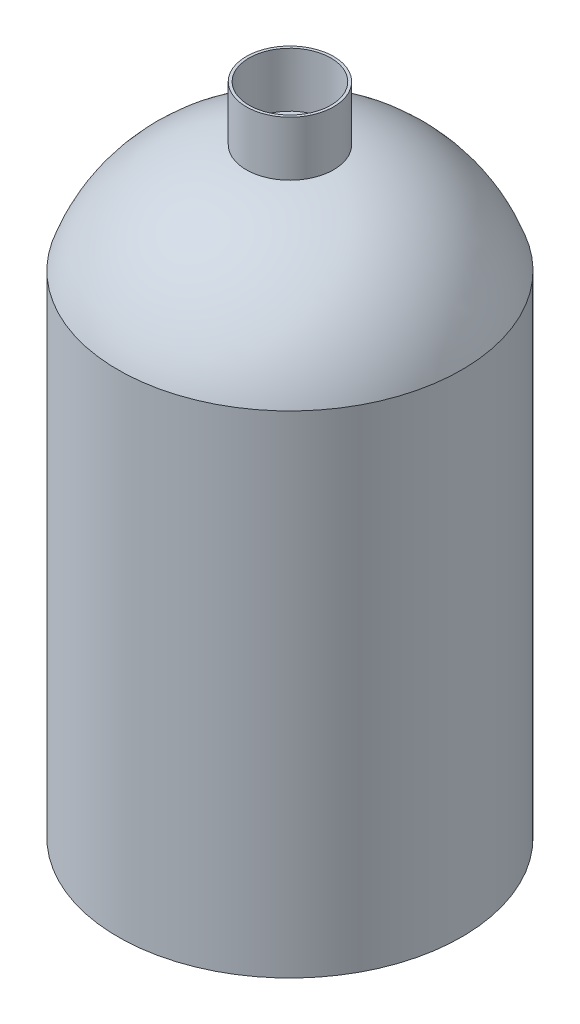
ISO-10303-21;
HEADER;
FILE_DESCRIPTION(('STEP AP214'),'2;1');
FILE_NAME('part.step','',(''),(''),'','','');
FILE_SCHEMA(('AUTOMOTIVE_DESIGN { 1 0 10303 214 1 1 1 1 }'));
ENDSEC;
DATA;
#1=APPLICATION_CONTEXT('core data for automotive mechanical design processes');
#2=APPLICATION_PROTOCOL_DEFINITION('international standard','automotive_design',2000,#1);
#3=PRODUCT_CONTEXT('',#1,'mechanical');
#4=PRODUCT('Part','Part','',(#3));
#5=PRODUCT_RELATED_PRODUCT_CATEGORY('part','',(#4));
#6=PRODUCT_DEFINITION_FORMATION('','',#4);
#7=PRODUCT_DEFINITION_CONTEXT('part definition',#1,'design');
#8=PRODUCT_DEFINITION('design','',#6,#7);
#9=PRODUCT_DEFINITION_SHAPE('','',#8);
#10=(LENGTH_UNIT() NAMED_UNIT(*) SI_UNIT(.MILLI.,.METRE.));
#11=(NAMED_UNIT(*) PLANE_ANGLE_UNIT() SI_UNIT($,.RADIAN.));
#12=(NAMED_UNIT(*) SI_UNIT($,.STERADIAN.) SOLID_ANGLE_UNIT());
#13=UNCERTAINTY_MEASURE_WITH_UNIT(LENGTH_MEASURE(1.E-05),#10,'distance_accuracy_value','');
#14=(GEOMETRIC_REPRESENTATION_CONTEXT(3) GLOBAL_UNCERTAINTY_ASSIGNED_CONTEXT((#13)) GLOBAL_UNIT_ASSIGNED_CONTEXT((#10,
#11,#12)) REPRESENTATION_CONTEXT('',''));
#15=CARTESIAN_POINT('',(0.,0.,0.));
#16=DIRECTION('',(0.,0.,1.));
#17=DIRECTION('',(1.,0.,0.));
#18=AXIS2_PLACEMENT_3D('',#15,#16,#17);
#19=CARTESIAN_POINT('',(0.,0.,0.));
#20=DIRECTION('',(0.,1.,0.));
#21=DIRECTION('',(0.,0.,1.));
#22=AXIS2_PLACEMENT_3D('',#19,#20,#21);
#23=PLANE('',#22);
#24=CARTESIAN_POINT('',(0.,0.,0.));
#25=DIRECTION('',(0.,-1.,0.));
#26=DIRECTION('',(0.,0.,-1.));
#27=AXIS2_PLACEMENT_3D('',#24,#25,#26);
#28=CIRCLE('',#27,6.3);
#29=CARTESIAN_POINT('',(0.,0.,-6.3));
#30=VERTEX_POINT('',#29);
#31=EDGE_CURVE('E57',#30,#30,#28,.T.);
#32=ORIENTED_EDGE('',*,*,#31,.T.);
#33=EDGE_LOOP('',(#32));
#34=FACE_BOUND('',#33,.T.);
#35=ADVANCED_FACE('F35',(#34),#23,.F.);
#36=CARTESIAN_POINT('',(0.,22.,0.));
#37=DIRECTION('',(0.,-1.,0.));
#38=DIRECTION('',(0.,0.,-1.));
#39=AXIS2_PLACEMENT_3D('',#36,#37,#38);
#40=PLANE('',#39);
#41=CARTESIAN_POINT('',(0.,22.,0.));
#42=DIRECTION('',(0.,-1.,0.));
#43=DIRECTION('',(0.,0.,-1.));
#44=AXIS2_PLACEMENT_3D('',#41,#42,#43);
#45=CIRCLE('',#44,1.5);
#46=CARTESIAN_POINT('',(0.,22.,-1.5));
#47=VERTEX_POINT('',#46);
#48=EDGE_CURVE('E10',#47,#47,#45,.T.);
#49=ORIENTED_EDGE('',*,*,#48,.F.);
#50=EDGE_LOOP('',(#49));
#51=FACE_BOUND('',#50,.T.);
#52=ADVANCED_FACE('F87',(#51),#40,.F.);
#53=CARTESIAN_POINT('',(0.,0.,0.));
#54=DIRECTION('',(0.,-1.,0.));
#55=DIRECTION('',(0.,0.,-1.));
#56=AXIS2_PLACEMENT_3D('',#53,#54,#55);
#57=CYLINDRICAL_SURFACE('',#56,1.5);
#58=CARTESIAN_POINT('',(0.,24.,0.));
#59=DIRECTION('',(0.,-1.,0.));
#60=DIRECTION('',(0.,0.,-1.));
#61=AXIS2_PLACEMENT_3D('',#58,#59,#60);
#62=CIRCLE('',#61,1.5);
#63=CARTESIAN_POINT('',(0.,24.,-1.5));
#64=VERTEX_POINT('',#63);
#65=EDGE_CURVE('E41',#64,#64,#62,.T.);
#66=ORIENTED_EDGE('',*,*,#65,.F.);
#67=EDGE_LOOP('',(#66));
#68=FACE_BOUND('',#67,.T.);
#69=ORIENTED_EDGE('',*,*,#48,.T.);
#70=EDGE_LOOP('',(#69));
#71=FACE_BOUND('',#70,.T.);
#72=ADVANCED_FACE('F82',(#68,#71),#57,.F.);
#73=CARTESIAN_POINT('',(-1.5,24.,0.));
#74=DIRECTION('',(0.,-1.,0.));
#75=DIRECTION('',(0.,0.,-1.));
#76=AXIS2_PLACEMENT_3D('',#73,#74,#75);
#77=PLANE('',#76);
#78=CARTESIAN_POINT('',(0.,24.,0.));
#79=DIRECTION('',(0.,-1.,0.));
#80=DIRECTION('',(0.,0.,-1.));
#81=AXIS2_PLACEMENT_3D('',#78,#79,#80);
#82=CIRCLE('',#81,1.6);
#83=CARTESIAN_POINT('',(0.,24.,-1.6));
#84=VERTEX_POINT('',#83);
#85=EDGE_CURVE('E45',#84,#84,#82,.T.);
#86=ORIENTED_EDGE('',*,*,#85,.F.);
#87=EDGE_LOOP('',(#86));
#88=FACE_BOUND('',#87,.T.);
#89=ORIENTED_EDGE('',*,*,#65,.T.);
#90=EDGE_LOOP('',(#89));
#91=FACE_BOUND('',#90,.T.);
#92=ADVANCED_FACE('F77',(#88,#91),#77,.F.);
#93=CARTESIAN_POINT('',(0.,0.,0.));
#94=DIRECTION('',(0.,-1.,0.));
#95=DIRECTION('',(0.,0.,-1.));
#96=AXIS2_PLACEMENT_3D('',#93,#94,#95);
#97=CYLINDRICAL_SURFACE('',#96,1.6);
#98=CARTESIAN_POINT('',(0.,22.,0.));
#99=DIRECTION('',(0.,-1.,0.));
#100=DIRECTION('',(0.,0.,-1.));
#101=AXIS2_PLACEMENT_3D('',#98,#99,#100);
#102=CIRCLE('',#101,1.6);
#103=CARTESIAN_POINT('',(0.,22.,-1.6));
#104=VERTEX_POINT('',#103);
#105=EDGE_CURVE('E49',#104,#104,#102,.T.);
#106=ORIENTED_EDGE('',*,*,#105,.F.);
#107=EDGE_LOOP('',(#106));
#108=FACE_BOUND('',#107,.T.);
#109=ORIENTED_EDGE('',*,*,#85,.T.);
#110=EDGE_LOOP('',(#109));
#111=FACE_BOUND('',#110,.T.);
#112=ADVANCED_FACE('F71',(#108,#111),#97,.T.);
#113=CARTESIAN_POINT('',(0.,16.0814006693592,0.));
#114=DIRECTION('',(0.,-1.,0.));
#115=DIRECTION('',(0.,0.,-1.));
#116=AXIS2_PLACEMENT_3D('',#113,#114,#115);
#117=DEGENERATE_TOROIDAL_SURFACE('',#116,0.615021846263186,6.,.T.);
#118=CARTESIAN_POINT('',(0.,18.,0.));
#119=DIRECTION('',(0.,-1.,0.));
#120=DIRECTION('',(0.,0.,-1.));
#121=AXIS2_PLACEMENT_3D('',#118,#119,#120);
#122=CIRCLE('',#121,6.3);
#123=CARTESIAN_POINT('',(0.,18.,-6.3));
#124=VERTEX_POINT('',#123);
#125=EDGE_CURVE('E54',#124,#124,#122,.T.);
#126=ORIENTED_EDGE('',*,*,#125,.F.);
#127=EDGE_LOOP('',(#126));
#128=FACE_BOUND('',#127,.T.);
#129=ORIENTED_EDGE('',*,*,#105,.T.);
#130=EDGE_LOOP('',(#129));
#131=FACE_BOUND('',#130,.T.);
#132=ADVANCED_FACE('F65',(#128,#131),#117,.T.);
#133=CARTESIAN_POINT('',(0.,0.,0.));
#134=DIRECTION('',(0.,-1.,0.));
#135=DIRECTION('',(0.,0.,-1.));
#136=AXIS2_PLACEMENT_3D('',#133,#134,#135);
#137=CYLINDRICAL_SURFACE('',#136,6.3);
#138=ORIENTED_EDGE('',*,*,#31,.F.);
#139=EDGE_LOOP('',(#138));
#140=FACE_BOUND('',#139,.T.);
#141=ORIENTED_EDGE('',*,*,#125,.T.);
#142=EDGE_LOOP('',(#141));
#143=FACE_BOUND('',#142,.T.);
#144=ADVANCED_FACE('F62',(#140,#143),#137,.T.);
#145=CLOSED_SHELL('',(#35,#52,#72,#92,#112,#132,#144));
#146=MANIFOLD_SOLID_BREP('B2',#145);
#147=ADVANCED_BREP_SHAPE_REPRESENTATION('',(#18,#146),#14);
#148=SHAPE_DEFINITION_REPRESENTATION(#9,#147);
ENDSEC;
END-ISO-10303-21;
